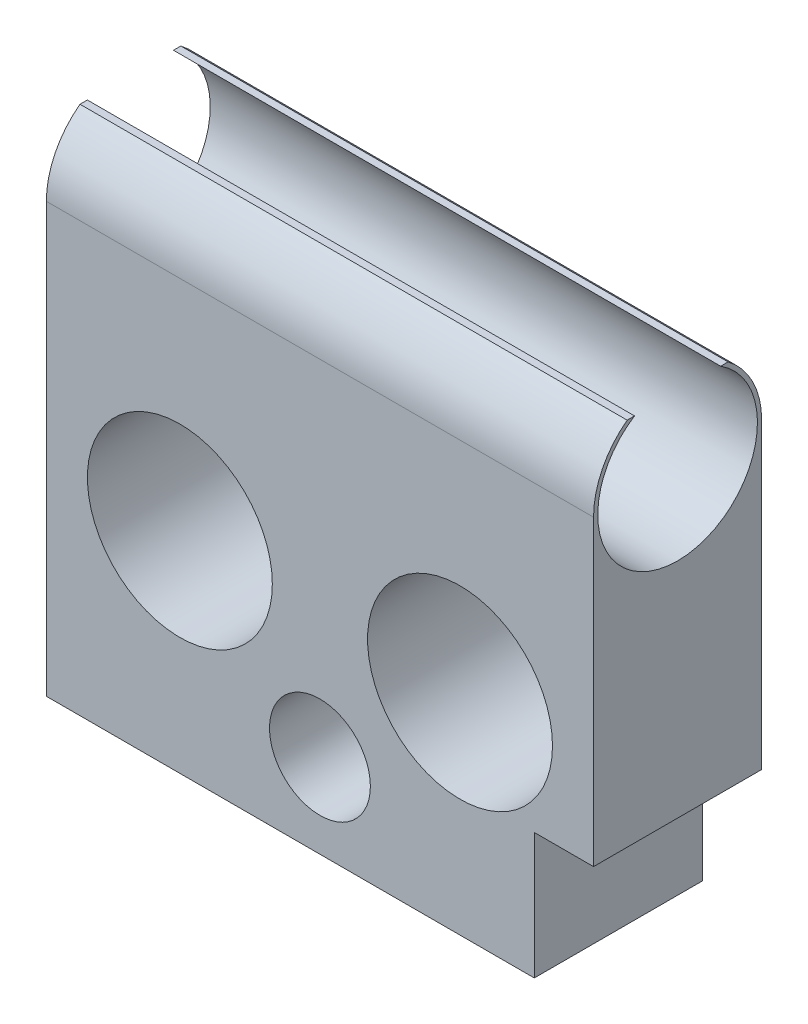
ISO-10303-21;
HEADER;
FILE_DESCRIPTION(('STEP AP214'),'2;1');
FILE_NAME('part.step','',(''),(''),'','','');
FILE_SCHEMA(('AUTOMOTIVE_DESIGN { 1 0 10303 214 1 1 1 1 }'));
ENDSEC;
DATA;
#1=APPLICATION_CONTEXT('core data for automotive mechanical design processes');
#2=APPLICATION_PROTOCOL_DEFINITION('international standard','automotive_design',2000,#1);
#3=PRODUCT_CONTEXT('',#1,'mechanical');
#4=PRODUCT('Part','Part','',(#3));
#5=PRODUCT_RELATED_PRODUCT_CATEGORY('part','',(#4));
#6=PRODUCT_DEFINITION_FORMATION('','',#4);
#7=PRODUCT_DEFINITION_CONTEXT('part definition',#1,'design');
#8=PRODUCT_DEFINITION('design','',#6,#7);
#9=PRODUCT_DEFINITION_SHAPE('','',#8);
#10=(LENGTH_UNIT() NAMED_UNIT(*) SI_UNIT(.MILLI.,.METRE.));
#11=(NAMED_UNIT(*) PLANE_ANGLE_UNIT() SI_UNIT($,.RADIAN.));
#12=(NAMED_UNIT(*) SI_UNIT($,.STERADIAN.) SOLID_ANGLE_UNIT());
#13=UNCERTAINTY_MEASURE_WITH_UNIT(LENGTH_MEASURE(1.E-05),#10,'distance_accuracy_value','');
#14=(GEOMETRIC_REPRESENTATION_CONTEXT(3) GLOBAL_UNCERTAINTY_ASSIGNED_CONTEXT((#13)) GLOBAL_UNIT_ASSIGNED_CONTEXT((#10,
#11,#12)) REPRESENTATION_CONTEXT('',''));
#15=CARTESIAN_POINT('',(0.,0.,0.));
#16=DIRECTION('',(0.,0.,1.));
#17=DIRECTION('',(1.,0.,0.));
#18=AXIS2_PLACEMENT_3D('',#15,#16,#17);
#19=CARTESIAN_POINT('',(32.55,26.,10.));
#20=DIRECTION('',(-1.,0.,0.));
#21=DIRECTION('',(0.,0.,1.));
#22=AXIS2_PLACEMENT_3D('',#19,#20,#21);
#23=CYLINDRICAL_SURFACE('',#22,10.);
#24=CARTESIAN_POINT('',(32.55,26.,10.));
#25=DIRECTION('',(1.,0.,0.));
#26=DIRECTION('',(0.,0.,1.));
#27=AXIS2_PLACEMENT_3D('',#24,#25,#26);
#28=CIRCLE('',#27,10.);
#29=CARTESIAN_POINT('',(32.55,34.,16.));
#30=VERTEX_POINT('',#29);
#31=CARTESIAN_POINT('',(32.55,26.,20.));
#32=VERTEX_POINT('',#31);
#33=EDGE_CURVE('E118',#30,#32,#28,.T.);
#34=ORIENTED_EDGE('',*,*,#33,.F.);
#35=DIRECTION('',(-1.,0.,0.));
#36=VECTOR('',#35,1.);
#37=CARTESIAN_POINT('',(32.55,34.,16.));
#38=LINE('',#37,#36);
#39=CARTESIAN_POINT('',(-32.55,34.,16.));
#40=VERTEX_POINT('',#39);
#41=EDGE_CURVE('E11',#30,#40,#38,.T.);
#42=ORIENTED_EDGE('',*,*,#41,.T.);
#43=CARTESIAN_POINT('',(-32.55,26.,10.));
#44=DIRECTION('',(1.,0.,0.));
#45=DIRECTION('',(0.,0.,1.));
#46=AXIS2_PLACEMENT_3D('',#43,#44,#45);
#47=CIRCLE('',#46,10.);
#48=CARTESIAN_POINT('',(-32.55,26.,20.));
#49=VERTEX_POINT('',#48);
#50=EDGE_CURVE('E131',#40,#49,#47,.T.);
#51=ORIENTED_EDGE('',*,*,#50,.T.);
#52=DIRECTION('',(-1.,0.,0.));
#53=VECTOR('',#52,1.);
#54=CARTESIAN_POINT('',(32.55,26.,20.));
#55=LINE('',#54,#53);
#56=EDGE_CURVE('E126',#32,#49,#55,.T.);
#57=ORIENTED_EDGE('',*,*,#56,.F.);
#58=EDGE_LOOP('',(#34,#42,#51,#57));
#59=FACE_BOUND('',#58,.T.);
#60=ADVANCED_FACE('F34',(#59),#23,.T.);
#61=CARTESIAN_POINT('',(0.,0.,20.));
#62=DIRECTION('',(0.,0.,-1.));
#63=DIRECTION('',(-1.,0.,0.));
#64=AXIS2_PLACEMENT_3D('',#61,#62,#63);
#65=PLANE('',#64);
#66=CARTESIAN_POINT('',(-16.665,0.,20.));
#67=DIRECTION('',(0.,0.,1.));
#68=DIRECTION('',(1.,0.,0.));
#69=AXIS2_PLACEMENT_3D('',#66,#67,#68);
#70=CIRCLE('',#69,11.);
#71=CARTESIAN_POINT('',(-5.665,0.,20.));
#72=VERTEX_POINT('',#71);
#73=EDGE_CURVE('E154',#72,#72,#70,.T.);
#74=ORIENTED_EDGE('',*,*,#73,.F.);
#75=EDGE_LOOP('',(#74));
#76=FACE_BOUND('',#75,.T.);
#77=CARTESIAN_POINT('',(0.,-15.,20.));
#78=DIRECTION('',(0.,0.,1.));
#79=DIRECTION('',(1.,0.,0.));
#80=AXIS2_PLACEMENT_3D('',#77,#78,#79);
#81=CIRCLE('',#80,6.);
#82=CARTESIAN_POINT('',(6.,-15.,20.));
#83=VERTEX_POINT('',#82);
#84=EDGE_CURVE('E142',#83,#83,#81,.T.);
#85=ORIENTED_EDGE('',*,*,#84,.F.);
#86=EDGE_LOOP('',(#85));
#87=FACE_BOUND('',#86,.T.);
#88=CARTESIAN_POINT('',(16.665,0.,20.));
#89=DIRECTION('',(0.,0.,1.));
#90=DIRECTION('',(1.,0.,0.));
#91=AXIS2_PLACEMENT_3D('',#88,#89,#90);
#92=CIRCLE('',#91,11.);
#93=CARTESIAN_POINT('',(27.665,0.,20.));
#94=VERTEX_POINT('',#93);
#95=EDGE_CURVE('E148',#94,#94,#92,.T.);
#96=ORIENTED_EDGE('',*,*,#95,.F.);
#97=EDGE_LOOP('',(#96));
#98=FACE_BOUND('',#97,.T.);
#99=DIRECTION('',(1.,0.,0.));
#100=VECTOR('',#99,1.);
#101=CARTESIAN_POINT('',(32.55,-25.,20.));
#102=LINE('',#101,#100);
#103=CARTESIAN_POINT('',(-32.55,-25.,20.));
#104=VERTEX_POINT('',#103);
#105=CARTESIAN_POINT('',(25.5,-25.,20.));
#106=VERTEX_POINT('',#105);
#107=EDGE_CURVE('E163',#104,#106,#102,.T.);
#108=ORIENTED_EDGE('',*,*,#107,.T.);
#109=DIRECTION('',(0.,-1.,0.));
#110=VECTOR('',#109,1.);
#111=CARTESIAN_POINT('',(25.5,-25.,20.));
#112=LINE('',#111,#110);
#113=CARTESIAN_POINT('',(25.5,-10.,20.));
#114=VERTEX_POINT('',#113);
#115=EDGE_CURVE('E208',#114,#106,#112,.T.);
#116=ORIENTED_EDGE('',*,*,#115,.F.);
#117=DIRECTION('',(-1.,0.,0.));
#118=VECTOR('',#117,1.);
#119=CARTESIAN_POINT('',(32.55,-10.,20.));
#120=LINE('',#119,#118);
#121=CARTESIAN_POINT('',(32.55,-10.,20.));
#122=VERTEX_POINT('',#121);
#123=EDGE_CURVE('E205',#122,#114,#120,.T.);
#124=ORIENTED_EDGE('',*,*,#123,.F.);
#125=DIRECTION('',(0.,1.,0.));
#126=VECTOR('',#125,1.);
#127=CARTESIAN_POINT('',(32.55,17.,20.));
#128=LINE('',#127,#126);
#129=EDGE_CURVE('E166',#122,#32,#128,.T.);
#130=ORIENTED_EDGE('',*,*,#129,.T.);
#131=ORIENTED_EDGE('',*,*,#56,.T.);
#132=DIRECTION('',(0.,-1.,0.));
#133=VECTOR('',#132,1.);
#134=CARTESIAN_POINT('',(-32.55,17.,20.));
#135=LINE('',#134,#133);
#136=EDGE_CURVE('E169',#49,#104,#135,.T.);
#137=ORIENTED_EDGE('',*,*,#136,.T.);
#138=EDGE_LOOP('',(#108,#116,#124,#130,#131,#137));
#139=FACE_BOUND('',#138,.T.);
#140=ADVANCED_FACE('F223',(#76,#87,#98,#139),#65,.F.);
#141=CARTESIAN_POINT('',(0.,0.,0.));
#142=DIRECTION('',(0.,0.,-1.));
#143=DIRECTION('',(-1.,0.,0.));
#144=AXIS2_PLACEMENT_3D('',#141,#142,#143);
#145=PLANE('',#144);
#146=DIRECTION('',(0.,-1.,0.));
#147=VECTOR('',#146,1.);
#148=CARTESIAN_POINT('',(25.5,-25.,0.));
#149=LINE('',#148,#147);
#150=CARTESIAN_POINT('',(25.5,-10.,0.));
#151=VERTEX_POINT('',#150);
#152=CARTESIAN_POINT('',(25.5,-25.,0.));
#153=VERTEX_POINT('',#152);
#154=EDGE_CURVE('E207',#151,#153,#149,.T.);
#155=ORIENTED_EDGE('',*,*,#154,.T.);
#156=DIRECTION('',(1.,0.,0.));
#157=VECTOR('',#156,1.);
#158=CARTESIAN_POINT('',(-30.55,-25.,0.));
#159=LINE('',#158,#157);
#160=CARTESIAN_POINT('',(-32.55,-25.,0.));
#161=VERTEX_POINT('',#160);
#162=EDGE_CURVE('E167',#161,#153,#159,.T.);
#163=ORIENTED_EDGE('',*,*,#162,.F.);
#164=DIRECTION('',(0.,-1.,0.));
#165=VECTOR('',#164,1.);
#166=CARTESIAN_POINT('',(-32.55,-25.,0.));
#167=LINE('',#166,#165);
#168=CARTESIAN_POINT('',(-32.55,26.,0.));
#169=VERTEX_POINT('',#168);
#170=EDGE_CURVE('E173',#169,#161,#167,.T.);
#171=ORIENTED_EDGE('',*,*,#170,.F.);
#172=DIRECTION('',(-1.,0.,0.));
#173=VECTOR('',#172,1.);
#174=CARTESIAN_POINT('',(32.55,26.,0.));
#175=LINE('',#174,#173);
#176=CARTESIAN_POINT('',(32.55,26.,0.));
#177=VERTEX_POINT('',#176);
#178=EDGE_CURVE('E137',#177,#169,#175,.T.);
#179=ORIENTED_EDGE('',*,*,#178,.F.);
#180=DIRECTION('',(0.,1.,0.));
#181=VECTOR('',#180,1.);
#182=CARTESIAN_POINT('',(32.55,17.,0.));
#183=LINE('',#182,#181);
#184=CARTESIAN_POINT('',(32.55,-10.,0.));
#185=VERTEX_POINT('',#184);
#186=EDGE_CURVE('E160',#185,#177,#183,.T.);
#187=ORIENTED_EDGE('',*,*,#186,.F.);
#188=DIRECTION('',(-1.,0.,0.));
#189=VECTOR('',#188,1.);
#190=CARTESIAN_POINT('',(32.55,-10.,0.));
#191=LINE('',#190,#189);
#192=EDGE_CURVE('E191',#185,#151,#191,.T.);
#193=ORIENTED_EDGE('',*,*,#192,.T.);
#194=EDGE_LOOP('',(#155,#163,#171,#179,#187,#193));
#195=FACE_BOUND('',#194,.T.);
#196=CARTESIAN_POINT('',(16.665,0.,0.));
#197=DIRECTION('',(0.,0.,1.));
#198=DIRECTION('',(1.,0.,0.));
#199=AXIS2_PLACEMENT_3D('',#196,#197,#198);
#200=CIRCLE('',#199,11.);
#201=CARTESIAN_POINT('',(27.665,0.,0.));
#202=VERTEX_POINT('',#201);
#203=EDGE_CURVE('E151',#202,#202,#200,.T.);
#204=ORIENTED_EDGE('',*,*,#203,.T.);
#205=EDGE_LOOP('',(#204));
#206=FACE_BOUND('',#205,.T.);
#207=CARTESIAN_POINT('',(0.,-15.,0.));
#208=DIRECTION('',(0.,0.,1.));
#209=DIRECTION('',(1.,0.,0.));
#210=AXIS2_PLACEMENT_3D('',#207,#208,#209);
#211=CIRCLE('',#210,6.);
#212=CARTESIAN_POINT('',(6.,-15.,0.));
#213=VERTEX_POINT('',#212);
#214=EDGE_CURVE('E145',#213,#213,#211,.T.);
#215=ORIENTED_EDGE('',*,*,#214,.T.);
#216=EDGE_LOOP('',(#215));
#217=FACE_BOUND('',#216,.T.);
#218=CARTESIAN_POINT('',(-16.665,0.,0.));
#219=DIRECTION('',(0.,0.,1.));
#220=DIRECTION('',(1.,0.,0.));
#221=AXIS2_PLACEMENT_3D('',#218,#219,#220);
#222=CIRCLE('',#221,11.);
#223=CARTESIAN_POINT('',(-5.665,0.,0.));
#224=VERTEX_POINT('',#223);
#225=EDGE_CURVE('E157',#224,#224,#222,.T.);
#226=ORIENTED_EDGE('',*,*,#225,.T.);
#227=EDGE_LOOP('',(#226));
#228=FACE_BOUND('',#227,.T.);
#229=ADVANCED_FACE('F189',(#195,#206,#217,#228),#145,.T.);
#230=CARTESIAN_POINT('',(32.55,17.,20.));
#231=DIRECTION('',(-1.,0.,0.));
#232=DIRECTION('',(0.,0.,1.));
#233=AXIS2_PLACEMENT_3D('',#230,#231,#232);
#234=PLANE('',#233);
#235=CARTESIAN_POINT('',(32.55,34.,3.99999999999998));
#236=VERTEX_POINT('',#235);
#237=EDGE_CURVE('E127',#177,#236,#28,.T.);
#238=ORIENTED_EDGE('',*,*,#237,.T.);
#239=DIRECTION('',(0.,0.,-1.));
#240=VECTOR('',#239,1.);
#241=CARTESIAN_POINT('',(32.55,34.,0.));
#242=LINE('',#241,#240);
#243=CARTESIAN_POINT('',(32.55,34.,4.87652461702018));
#244=VERTEX_POINT('',#243);
#245=EDGE_CURVE('E49',#244,#236,#242,.T.);
#246=ORIENTED_EDGE('',*,*,#245,.F.);
#247=CARTESIAN_POINT('',(32.55,26.,10.));
#248=DIRECTION('',(-1.,0.,0.));
#249=DIRECTION('',(0.,0.,1.));
#250=AXIS2_PLACEMENT_3D('',#247,#248,#249);
#251=CIRCLE('',#250,9.5);
#252=CARTESIAN_POINT('',(32.55,34.,15.1234753829798));
#253=VERTEX_POINT('',#252);
#254=EDGE_CURVE('E121',#244,#253,#251,.T.);
#255=ORIENTED_EDGE('',*,*,#254,.T.);
#256=EDGE_CURVE('E109',#30,#253,#242,.T.);
#257=ORIENTED_EDGE('',*,*,#256,.F.);
#258=ORIENTED_EDGE('',*,*,#33,.T.);
#259=ORIENTED_EDGE('',*,*,#129,.F.);
#260=DIRECTION('',(0.,0.,1.));
#261=VECTOR('',#260,1.);
#262=CARTESIAN_POINT('',(32.55,-10.,0.));
#263=LINE('',#262,#261);
#264=EDGE_CURVE('E134',#185,#122,#263,.T.);
#265=ORIENTED_EDGE('',*,*,#264,.F.);
#266=ORIENTED_EDGE('',*,*,#186,.T.);
#267=EDGE_LOOP('',(#238,#246,#255,#257,#258,#259,#265,#266));
#268=FACE_BOUND('',#267,.T.);
#269=ADVANCED_FACE('F36',(#268),#234,.F.);
#270=CARTESIAN_POINT('',(-32.55,-25.,20.));
#271=DIRECTION('',(1.,0.,0.));
#272=DIRECTION('',(0.,1.,0.));
#273=AXIS2_PLACEMENT_3D('',#270,#271,#272);
#274=PLANE('',#273);
#275=ORIENTED_EDGE('',*,*,#50,.F.);
#276=DIRECTION('',(0.,0.,1.));
#277=VECTOR('',#276,1.);
#278=CARTESIAN_POINT('',(-32.55,34.,0.));
#279=LINE('',#278,#277);
#280=CARTESIAN_POINT('',(-32.55,34.,15.1234753829798));
#281=VERTEX_POINT('',#280);
#282=EDGE_CURVE('E57',#281,#40,#279,.T.);
#283=ORIENTED_EDGE('',*,*,#282,.F.);
#284=CARTESIAN_POINT('',(-32.55,26.,10.));
#285=DIRECTION('',(-1.,0.,0.));
#286=DIRECTION('',(0.,0.,1.));
#287=AXIS2_PLACEMENT_3D('',#284,#285,#286);
#288=CIRCLE('',#287,9.5);
#289=CARTESIAN_POINT('',(-32.55,34.,4.8765246170202));
#290=VERTEX_POINT('',#289);
#291=EDGE_CURVE('E139',#290,#281,#288,.T.);
#292=ORIENTED_EDGE('',*,*,#291,.F.);
#293=CARTESIAN_POINT('',(-32.55,34.,4.));
#294=VERTEX_POINT('',#293);
#295=EDGE_CURVE('E198',#294,#290,#279,.T.);
#296=ORIENTED_EDGE('',*,*,#295,.F.);
#297=EDGE_CURVE('E128',#169,#294,#47,.T.);
#298=ORIENTED_EDGE('',*,*,#297,.F.);
#299=ORIENTED_EDGE('',*,*,#170,.T.);
#300=DIRECTION('',(0.,0.,-1.));
#301=VECTOR('',#300,1.);
#302=CARTESIAN_POINT('',(-32.55,-25.,20.));
#303=LINE('',#302,#301);
#304=EDGE_CURVE('E171',#104,#161,#303,.T.);
#305=ORIENTED_EDGE('',*,*,#304,.F.);
#306=ORIENTED_EDGE('',*,*,#136,.F.);
#307=EDGE_LOOP('',(#275,#283,#292,#296,#298,#299,#305,#306));
#308=FACE_BOUND('',#307,.T.);
#309=ADVANCED_FACE('F195',(#308),#274,.F.);
#310=CARTESIAN_POINT('',(-30.55,-25.,20.));
#311=DIRECTION('',(0.,1.,0.));
#312=DIRECTION('',(-1.,0.,0.));
#313=AXIS2_PLACEMENT_3D('',#310,#311,#312);
#314=PLANE('',#313);
#315=ORIENTED_EDGE('',*,*,#162,.T.);
#316=DIRECTION('',(0.,0.,1.));
#317=VECTOR('',#316,1.);
#318=CARTESIAN_POINT('',(25.5,-25.,0.));
#319=LINE('',#318,#317);
#320=EDGE_CURVE('E213',#153,#106,#319,.T.);
#321=ORIENTED_EDGE('',*,*,#320,.T.);
#322=ORIENTED_EDGE('',*,*,#107,.F.);
#323=ORIENTED_EDGE('',*,*,#304,.T.);
#324=EDGE_LOOP('',(#315,#321,#322,#323));
#325=FACE_BOUND('',#324,.T.);
#326=ADVANCED_FACE('F227',(#325),#314,.F.);
#327=CARTESIAN_POINT('',(-16.665,0.,0.));
#328=DIRECTION('',(0.,0.,1.));
#329=DIRECTION('',(1.,0.,0.));
#330=AXIS2_PLACEMENT_3D('',#327,#328,#329);
#331=CYLINDRICAL_SURFACE('',#330,11.);
#332=ORIENTED_EDGE('',*,*,#225,.F.);
#333=EDGE_LOOP('',(#332));
#334=FACE_BOUND('',#333,.T.);
#335=ORIENTED_EDGE('',*,*,#73,.T.);
#336=EDGE_LOOP('',(#335));
#337=FACE_BOUND('',#336,.T.);
#338=ADVANCED_FACE('F262',(#334,#337),#331,.F.);
#339=CARTESIAN_POINT('',(0.,-15.,0.));
#340=DIRECTION('',(0.,0.,1.));
#341=DIRECTION('',(1.,0.,0.));
#342=AXIS2_PLACEMENT_3D('',#339,#340,#341);
#343=CYLINDRICAL_SURFACE('',#342,6.);
#344=ORIENTED_EDGE('',*,*,#214,.F.);
#345=EDGE_LOOP('',(#344));
#346=FACE_BOUND('',#345,.T.);
#347=ORIENTED_EDGE('',*,*,#84,.T.);
#348=EDGE_LOOP('',(#347));
#349=FACE_BOUND('',#348,.T.);
#350=ADVANCED_FACE('F257',(#346,#349),#343,.F.);
#351=CARTESIAN_POINT('',(16.665,0.,0.));
#352=DIRECTION('',(0.,0.,1.));
#353=DIRECTION('',(1.,0.,0.));
#354=AXIS2_PLACEMENT_3D('',#351,#352,#353);
#355=CYLINDRICAL_SURFACE('',#354,11.);
#356=ORIENTED_EDGE('',*,*,#203,.F.);
#357=EDGE_LOOP('',(#356));
#358=FACE_BOUND('',#357,.T.);
#359=ORIENTED_EDGE('',*,*,#95,.T.);
#360=EDGE_LOOP('',(#359));
#361=FACE_BOUND('',#360,.T.);
#362=ADVANCED_FACE('F253',(#358,#361),#355,.F.);
#363=CARTESIAN_POINT('',(32.55,26.,10.));
#364=DIRECTION('',(-1.,0.,0.));
#365=DIRECTION('',(0.,0.,1.));
#366=AXIS2_PLACEMENT_3D('',#363,#364,#365);
#367=CYLINDRICAL_SURFACE('',#366,9.5);
#368=ORIENTED_EDGE('',*,*,#291,.T.);
#369=DIRECTION('',(-1.,0.,0.));
#370=VECTOR('',#369,1.);
#371=CARTESIAN_POINT('',(32.55,34.,15.1234753829798));
#372=LINE('',#371,#370);
#373=EDGE_CURVE('E203',#281,#253,#372,.F.);
#374=ORIENTED_EDGE('',*,*,#373,.T.);
#375=ORIENTED_EDGE('',*,*,#254,.F.);
#376=DIRECTION('',(-1.,0.,0.));
#377=VECTOR('',#376,1.);
#378=CARTESIAN_POINT('',(32.55,34.,4.87652461702019));
#379=LINE('',#378,#377);
#380=EDGE_CURVE('E122',#244,#290,#379,.T.);
#381=ORIENTED_EDGE('',*,*,#380,.T.);
#382=EDGE_LOOP('',(#368,#374,#375,#381));
#383=FACE_BOUND('',#382,.T.);
#384=ADVANCED_FACE('F230',(#383),#367,.F.);
#385=ORIENTED_EDGE('',*,*,#297,.T.);
#386=DIRECTION('',(-1.,0.,0.));
#387=VECTOR('',#386,1.);
#388=CARTESIAN_POINT('',(32.55,34.,3.99999999999999));
#389=LINE('',#388,#387);
#390=EDGE_CURVE('E42',#294,#236,#389,.F.);
#391=ORIENTED_EDGE('',*,*,#390,.T.);
#392=ORIENTED_EDGE('',*,*,#237,.F.);
#393=ORIENTED_EDGE('',*,*,#178,.T.);
#394=EDGE_LOOP('',(#385,#391,#392,#393));
#395=FACE_BOUND('',#394,.T.);
#396=ADVANCED_FACE('F180',(#395),#23,.T.);
#397=CARTESIAN_POINT('',(25.5,-25.,0.));
#398=DIRECTION('',(-1.,0.,0.));
#399=DIRECTION('',(0.,0.,1.));
#400=AXIS2_PLACEMENT_3D('',#397,#398,#399);
#401=PLANE('',#400);
#402=ORIENTED_EDGE('',*,*,#115,.T.);
#403=ORIENTED_EDGE('',*,*,#320,.F.);
#404=ORIENTED_EDGE('',*,*,#154,.F.);
#405=DIRECTION('',(0.,0.,1.));
#406=VECTOR('',#405,1.);
#407=CARTESIAN_POINT('',(25.5,-10.,0.));
#408=LINE('',#407,#406);
#409=EDGE_CURVE('E215',#151,#114,#408,.T.);
#410=ORIENTED_EDGE('',*,*,#409,.T.);
#411=EDGE_LOOP('',(#402,#403,#404,#410));
#412=FACE_BOUND('',#411,.T.);
#413=ADVANCED_FACE('F225',(#412),#401,.F.);
#414=CARTESIAN_POINT('',(32.55,-10.,0.));
#415=DIRECTION('',(0.,1.,0.));
#416=DIRECTION('',(0.,0.,1.));
#417=AXIS2_PLACEMENT_3D('',#414,#415,#416);
#418=PLANE('',#417);
#419=ORIENTED_EDGE('',*,*,#123,.T.);
#420=ORIENTED_EDGE('',*,*,#409,.F.);
#421=ORIENTED_EDGE('',*,*,#192,.F.);
#422=ORIENTED_EDGE('',*,*,#264,.T.);
#423=EDGE_LOOP('',(#419,#420,#421,#422));
#424=FACE_BOUND('',#423,.T.);
#425=ADVANCED_FACE('F220',(#424),#418,.F.);
#426=CARTESIAN_POINT('',(52.6497512422418,34.,0.));
#427=DIRECTION('',(0.,-1.,0.));
#428=DIRECTION('',(1.,0.,0.));
#429=AXIS2_PLACEMENT_3D('',#426,#427,#428);
#430=PLANE('',#429);
#431=ORIENTED_EDGE('',*,*,#245,.T.);
#432=ORIENTED_EDGE('',*,*,#390,.F.);
#433=ORIENTED_EDGE('',*,*,#295,.T.);
#434=ORIENTED_EDGE('',*,*,#380,.F.);
#435=EDGE_LOOP('',(#431,#432,#433,#434));
#436=FACE_BOUND('',#435,.T.);
#437=ADVANCED_FACE('F231',(#436),#430,.F.);
#438=ORIENTED_EDGE('',*,*,#282,.T.);
#439=ORIENTED_EDGE('',*,*,#41,.F.);
#440=ORIENTED_EDGE('',*,*,#256,.T.);
#441=ORIENTED_EDGE('',*,*,#373,.F.);
#442=EDGE_LOOP('',(#438,#439,#440,#441));
#443=FACE_BOUND('',#442,.T.);
#444=ADVANCED_FACE('F108',(#443),#430,.F.);
#445=CLOSED_SHELL('',(#60,#140,#229,#269,#309,#326,#338,#350,#362,#384,#396,#413,#425,#437,#444));
#446=MANIFOLD_SOLID_BREP('B2',#445);
#447=ADVANCED_BREP_SHAPE_REPRESENTATION('',(#18,#446),#14);
#448=SHAPE_DEFINITION_REPRESENTATION(#9,#447);
ENDSEC;
END-ISO-10303-21;
